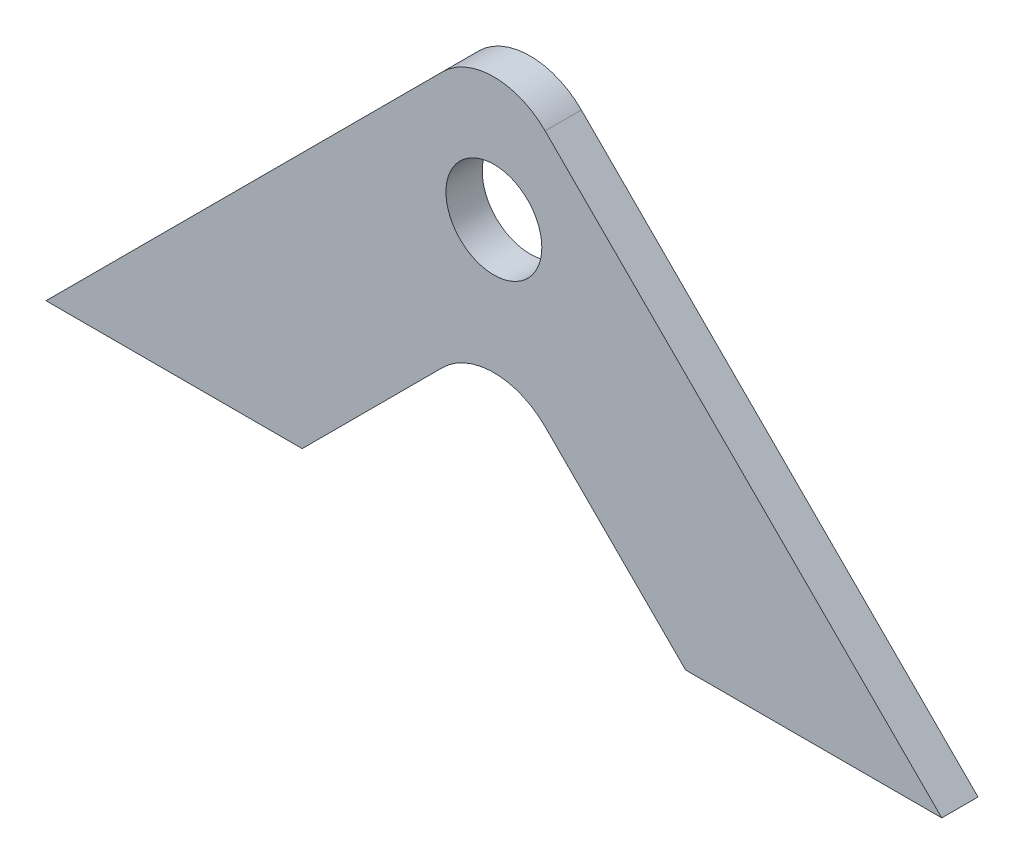
ISO-10303-21;
HEADER;
FILE_DESCRIPTION(('STEP AP214'),'2;1');
FILE_NAME('part.step','',(''),(''),'','','');
FILE_SCHEMA(('AUTOMOTIVE_DESIGN { 1 0 10303 214 1 1 1 1 }'));
ENDSEC;
DATA;
#1=APPLICATION_CONTEXT('core data for automotive mechanical design processes');
#2=APPLICATION_PROTOCOL_DEFINITION('international standard','automotive_design',2000,#1);
#3=PRODUCT_CONTEXT('',#1,'mechanical');
#4=PRODUCT('Part','Part','',(#3));
#5=PRODUCT_RELATED_PRODUCT_CATEGORY('part','',(#4));
#6=PRODUCT_DEFINITION_FORMATION('','',#4);
#7=PRODUCT_DEFINITION_CONTEXT('part definition',#1,'design');
#8=PRODUCT_DEFINITION('design','',#6,#7);
#9=PRODUCT_DEFINITION_SHAPE('','',#8);
#10=(LENGTH_UNIT() NAMED_UNIT(*) SI_UNIT(.MILLI.,.METRE.));
#11=(NAMED_UNIT(*) PLANE_ANGLE_UNIT() SI_UNIT($,.RADIAN.));
#12=(NAMED_UNIT(*) SI_UNIT($,.STERADIAN.) SOLID_ANGLE_UNIT());
#13=UNCERTAINTY_MEASURE_WITH_UNIT(LENGTH_MEASURE(1.E-05),#10,'distance_accuracy_value','');
#14=(GEOMETRIC_REPRESENTATION_CONTEXT(3) GLOBAL_UNCERTAINTY_ASSIGNED_CONTEXT((#13)) GLOBAL_UNIT_ASSIGNED_CONTEXT((#10,
#11,#12)) REPRESENTATION_CONTEXT('',''));
#15=CARTESIAN_POINT('',(0.,0.,0.));
#16=DIRECTION('',(0.,0.,1.));
#17=DIRECTION('',(1.,0.,0.));
#18=AXIS2_PLACEMENT_3D('',#15,#16,#17);
#19=CARTESIAN_POINT('',(44.8343967267449,44.8352566752149,3.175));
#20=DIRECTION('',(0.707099999869934,0.707113562438128,0.));
#21=DIRECTION('',(-0.707113562438128,0.707099999869934,0.));
#22=AXIS2_PLACEMENT_3D('',#19,#20,#21);
#23=PLANE('',#22);
#24=DIRECTION('',(0.707113562438128,-0.707099999869934,0.));
#25=VECTOR('',#24,1.);
#26=CARTESIAN_POINT('',(44.8343967267449,44.8352566752149,0.));
#27=LINE('',#26,#25);
#28=CARTESIAN_POINT('',(42.5900849991741,47.079525356474,0.));
#29=VERTEX_POINT('',#28);
#30=CARTESIAN_POINT('',(77.3512770817062,12.319,0.));
#31=VERTEX_POINT('',#30);
#32=EDGE_CURVE('E172',#29,#31,#27,.T.);
#33=ORIENTED_EDGE('',*,*,#32,.F.);
#34=DIRECTION('',(0.,0.,-1.));
#35=VECTOR('',#34,1.);
#36=CARTESIAN_POINT('',(42.5900849991741,47.079525356474,3.175));
#37=LINE('',#36,#35);
#38=CARTESIAN_POINT('',(42.5900849991741,47.079525356474,3.175));
#39=VERTEX_POINT('',#38);
#40=EDGE_CURVE('E11',#39,#29,#37,.T.);
#41=ORIENTED_EDGE('',*,*,#40,.F.);
#42=DIRECTION('',(0.707113562438128,-0.707099999869934,0.));
#43=VECTOR('',#42,1.);
#44=CARTESIAN_POINT('',(44.8343967267449,44.8352566752149,3.175));
#45=LINE('',#44,#43);
#46=CARTESIAN_POINT('',(77.3512770817062,12.319,3.175));
#47=VERTEX_POINT('',#46);
#48=EDGE_CURVE('E205',#39,#47,#45,.T.);
#49=ORIENTED_EDGE('',*,*,#48,.T.);
#50=DIRECTION('',(0.,0.,-1.));
#51=VECTOR('',#50,1.);
#52=CARTESIAN_POINT('',(77.3512770817062,12.319,3.175));
#53=LINE('',#52,#51);
#54=EDGE_CURVE('E99',#47,#31,#53,.T.);
#55=ORIENTED_EDGE('',*,*,#54,.T.);
#56=EDGE_LOOP('',(#33,#41,#49,#55));
#57=FACE_BOUND('',#56,.T.);
#58=ADVANCED_FACE('F47',(#57),#23,.T.);
#59=CARTESIAN_POINT('',(38.1,42.5893542349919,3.175));
#60=DIRECTION('',(0.,0.,-1.));
#61=DIRECTION('',(-1.,0.,0.));
#62=AXIS2_PLACEMENT_3D('',#59,#60,#61);
#63=CYLINDRICAL_SURFACE('',#62,6.35);
#64=CARTESIAN_POINT('',(38.1,42.5893542349919,0.));
#65=DIRECTION('',(0.,0.,1.));
#66=DIRECTION('',(1.,0.,0.));
#67=AXIS2_PLACEMENT_3D('',#64,#65,#66);
#68=CIRCLE('',#67,6.35);
#69=CARTESIAN_POINT('',(33.6099150008259,47.079525356474,0.));
#70=VERTEX_POINT('',#69);
#71=EDGE_CURVE('E169',#29,#70,#68,.T.);
#72=ORIENTED_EDGE('',*,*,#71,.T.);
#73=DIRECTION('',(0.,0.,-1.));
#74=VECTOR('',#73,1.);
#75=CARTESIAN_POINT('',(33.6099150008259,47.079525356474,3.175));
#76=LINE('',#75,#74);
#77=CARTESIAN_POINT('',(33.6099150008259,47.079525356474,3.175));
#78=VERTEX_POINT('',#77);
#79=EDGE_CURVE('E57',#78,#70,#76,.T.);
#80=ORIENTED_EDGE('',*,*,#79,.F.);
#81=CARTESIAN_POINT('',(38.1,42.5893542349919,3.175));
#82=DIRECTION('',(0.,0.,1.));
#83=DIRECTION('',(1.,0.,0.));
#84=AXIS2_PLACEMENT_3D('',#81,#82,#83);
#85=CIRCLE('',#84,6.35);
#86=EDGE_CURVE('E203',#39,#78,#85,.T.);
#87=ORIENTED_EDGE('',*,*,#86,.F.);
#88=ORIENTED_EDGE('',*,*,#40,.T.);
#89=EDGE_LOOP('',(#72,#80,#87,#88));
#90=FACE_BOUND('',#89,.T.);
#91=ADVANCED_FACE('F170',(#90),#63,.T.);
#92=CARTESIAN_POINT('',(-6.73512749876113,6.73525668222317,3.175));
#93=DIRECTION('',(-0.707099999869934,0.707113562438127,0.));
#94=DIRECTION('',(-0.707113562438127,-0.707099999869934,0.));
#95=AXIS2_PLACEMENT_3D('',#92,#93,#94);
#96=PLANE('',#95);
#97=DIRECTION('',(0.707113562438127,0.707099999869934,0.));
#98=VECTOR('',#97,1.);
#99=CARTESIAN_POINT('',(-6.73512749876113,6.73525668222317,0.));
#100=LINE('',#99,#98);
#101=CARTESIAN_POINT('',(-1.15127708170621,12.319,0.));
#102=VERTEX_POINT('',#101);
#103=EDGE_CURVE('E164',#102,#70,#100,.T.);
#104=ORIENTED_EDGE('',*,*,#103,.F.);
#105=DIRECTION('',(0.,0.,-1.));
#106=VECTOR('',#105,1.);
#107=CARTESIAN_POINT('',(-1.15127708170621,12.319,3.175));
#108=LINE('',#107,#106);
#109=CARTESIAN_POINT('',(-1.15127708170621,12.319,3.175));
#110=VERTEX_POINT('',#109);
#111=EDGE_CURVE('E154',#110,#102,#108,.T.);
#112=ORIENTED_EDGE('',*,*,#111,.F.);
#113=DIRECTION('',(0.707113562438127,0.707099999869934,0.));
#114=VECTOR('',#113,1.);
#115=CARTESIAN_POINT('',(-6.73512749876113,6.73525668222317,3.175));
#116=LINE('',#115,#114);
#117=EDGE_CURVE('E166',#110,#78,#116,.T.);
#118=ORIENTED_EDGE('',*,*,#117,.T.);
#119=ORIENTED_EDGE('',*,*,#79,.T.);
#120=EDGE_LOOP('',(#104,#112,#118,#119));
#121=FACE_BOUND('',#120,.T.);
#122=ADVANCED_FACE('F162',(#121),#96,.T.);
#123=CARTESIAN_POINT('',(0.,12.319,3.175));
#124=DIRECTION('',(0.,1.,0.));
#125=DIRECTION('',(0.,0.,1.));
#126=AXIS2_PLACEMENT_3D('',#123,#124,#125);
#127=PLANE('',#126);
#128=DIRECTION('',(1.,0.,0.));
#129=VECTOR('',#128,1.);
#130=CARTESIAN_POINT('',(0.,12.319,0.));
#131=LINE('',#130,#129);
#132=CARTESIAN_POINT('',(21.299578529834,12.319,0.));
#133=VERTEX_POINT('',#132);
#134=EDGE_CURVE('E177',#102,#133,#131,.T.);
#135=ORIENTED_EDGE('',*,*,#134,.T.);
#136=DIRECTION('',(0.,0.,-1.));
#137=VECTOR('',#136,1.);
#138=CARTESIAN_POINT('',(21.299578529834,12.319,3.175));
#139=LINE('',#138,#137);
#140=CARTESIAN_POINT('',(21.299578529834,12.319,3.175));
#141=VERTEX_POINT('',#140);
#142=EDGE_CURVE('E146',#141,#133,#139,.T.);
#143=ORIENTED_EDGE('',*,*,#142,.F.);
#144=DIRECTION('',(1.,0.,0.));
#145=VECTOR('',#144,1.);
#146=CARTESIAN_POINT('',(0.,12.319,3.175));
#147=LINE('',#146,#145);
#148=EDGE_CURVE('E195',#110,#141,#147,.T.);
#149=ORIENTED_EDGE('',*,*,#148,.F.);
#150=ORIENTED_EDGE('',*,*,#111,.T.);
#151=EDGE_LOOP('',(#135,#143,#149,#150));
#152=FACE_BOUND('',#151,.T.);
#153=ADVANCED_FACE('F232',(#152),#127,.F.);
#154=CARTESIAN_POINT('',(4.49008499917408,-4.49017112148211,3.175));
#155=DIRECTION('',(-0.707099999869934,0.707113562438127,0.));
#156=DIRECTION('',(-0.707113562438128,-0.707099999869934,0.));
#157=AXIS2_PLACEMENT_3D('',#154,#155,#156);
#158=PLANE('',#157);
#159=DIRECTION('',(0.707113562438128,0.707099999869934,0.));
#160=VECTOR('',#159,1.);
#161=CARTESIAN_POINT('',(4.49008499917408,-4.49017112148211,0.));
#162=LINE('',#161,#160);
#163=CARTESIAN_POINT('',(33.6099150008259,24.629100356474,0.));
#164=VERTEX_POINT('',#163);
#165=EDGE_CURVE('E181',#133,#164,#162,.T.);
#166=ORIENTED_EDGE('',*,*,#165,.T.);
#167=DIRECTION('',(0.,0.,-1.));
#168=VECTOR('',#167,1.);
#169=CARTESIAN_POINT('',(33.6099150008259,24.629100356474,3.175));
#170=LINE('',#169,#168);
#171=CARTESIAN_POINT('',(33.6099150008259,24.629100356474,3.175));
#172=VERTEX_POINT('',#171);
#173=EDGE_CURVE('E142',#172,#164,#170,.T.);
#174=ORIENTED_EDGE('',*,*,#173,.F.);
#175=DIRECTION('',(0.707113562438128,0.707099999869934,0.));
#176=VECTOR('',#175,1.);
#177=CARTESIAN_POINT('',(4.49008499917408,-4.49017112148211,3.175));
#178=LINE('',#177,#176);
#179=EDGE_CURVE('E133',#141,#172,#178,.T.);
#180=ORIENTED_EDGE('',*,*,#179,.F.);
#181=ORIENTED_EDGE('',*,*,#142,.T.);
#182=EDGE_LOOP('',(#166,#174,#180,#181));
#183=FACE_BOUND('',#182,.T.);
#184=ADVANCED_FACE('F242',(#183),#158,.F.);
#185=CARTESIAN_POINT('',(38.1,20.1389292349919,3.175));
#186=DIRECTION('',(0.,0.,-1.));
#187=DIRECTION('',(-1.,0.,0.));
#188=AXIS2_PLACEMENT_3D('',#185,#186,#187);
#189=CYLINDRICAL_SURFACE('',#188,6.35);
#190=CARTESIAN_POINT('',(38.1,20.1389292349919,0.));
#191=DIRECTION('',(0.,0.,1.));
#192=DIRECTION('',(1.,0.,0.));
#193=AXIS2_PLACEMENT_3D('',#190,#191,#192);
#194=CIRCLE('',#193,6.35);
#195=CARTESIAN_POINT('',(42.5900849991741,24.629100356474,0.));
#196=VERTEX_POINT('',#195);
#197=EDGE_CURVE('E140',#164,#196,#194,.F.);
#198=ORIENTED_EDGE('',*,*,#197,.T.);
#199=DIRECTION('',(0.,0.,-1.));
#200=VECTOR('',#199,1.);
#201=CARTESIAN_POINT('',(42.5900849991741,24.629100356474,3.175));
#202=LINE('',#201,#200);
#203=CARTESIAN_POINT('',(42.5900849991741,24.629100356474,3.175));
#204=VERTEX_POINT('',#203);
#205=EDGE_CURVE('E124',#204,#196,#202,.T.);
#206=ORIENTED_EDGE('',*,*,#205,.F.);
#207=CARTESIAN_POINT('',(38.1,20.1389292349919,3.175));
#208=DIRECTION('',(0.,0.,1.));
#209=DIRECTION('',(1.,0.,0.));
#210=AXIS2_PLACEMENT_3D('',#207,#208,#209);
#211=CIRCLE('',#210,6.35);
#212=EDGE_CURVE('E128',#172,#204,#211,.F.);
#213=ORIENTED_EDGE('',*,*,#212,.F.);
#214=ORIENTED_EDGE('',*,*,#173,.T.);
#215=EDGE_LOOP('',(#198,#206,#213,#214));
#216=FACE_BOUND('',#215,.T.);
#217=ADVANCED_FACE('F139',(#216),#189,.F.);
#218=CARTESIAN_POINT('',(33.6091842288097,33.6098288715097,3.175));
#219=DIRECTION('',(0.707099999869934,0.707113562438128,0.));
#220=DIRECTION('',(-0.707113562438128,0.707099999869934,0.));
#221=AXIS2_PLACEMENT_3D('',#218,#219,#220);
#222=PLANE('',#221);
#223=DIRECTION('',(0.707113562438128,-0.707099999869934,0.));
#224=VECTOR('',#223,1.);
#225=CARTESIAN_POINT('',(33.6091842288097,33.6098288715097,0.));
#226=LINE('',#225,#224);
#227=CARTESIAN_POINT('',(54.900421470166,12.319,0.));
#228=VERTEX_POINT('',#227);
#229=EDGE_CURVE('E190',#196,#228,#226,.T.);
#230=ORIENTED_EDGE('',*,*,#229,.T.);
#231=DIRECTION('',(0.,0.,-1.));
#232=VECTOR('',#231,1.);
#233=CARTESIAN_POINT('',(54.900421470166,12.319,3.175));
#234=LINE('',#233,#232);
#235=CARTESIAN_POINT('',(54.900421470166,12.319,3.175));
#236=VERTEX_POINT('',#235);
#237=EDGE_CURVE('E126',#236,#228,#234,.T.);
#238=ORIENTED_EDGE('',*,*,#237,.F.);
#239=DIRECTION('',(0.707113562438128,-0.707099999869934,0.));
#240=VECTOR('',#239,1.);
#241=CARTESIAN_POINT('',(33.6091842288097,33.6098288715097,3.175));
#242=LINE('',#241,#240);
#243=EDGE_CURVE('E119',#204,#236,#242,.T.);
#244=ORIENTED_EDGE('',*,*,#243,.F.);
#245=ORIENTED_EDGE('',*,*,#205,.T.);
#246=EDGE_LOOP('',(#230,#238,#244,#245));
#247=FACE_BOUND('',#246,.T.);
#248=ADVANCED_FACE('F122',(#247),#222,.F.);
#249=CARTESIAN_POINT('',(38.1,38.0992692349919,3.175));
#250=DIRECTION('',(0.,0.,-1.));
#251=DIRECTION('',(-1.,0.,0.));
#252=AXIS2_PLACEMENT_3D('',#249,#250,#251);
#253=CYLINDRICAL_SURFACE('',#252,4.19988999999999);
#254=CARTESIAN_POINT('',(38.1,38.0992692349919,3.175));
#255=DIRECTION('',(0.,0.,1.));
#256=DIRECTION('',(1.,0.,0.));
#257=AXIS2_PLACEMENT_3D('',#254,#255,#256);
#258=CIRCLE('',#257,4.19988999999999);
#259=CARTESIAN_POINT('',(42.29989,38.0992692349919,3.175));
#260=VERTEX_POINT('',#259);
#261=EDGE_CURVE('E210',#260,#260,#258,.T.);
#262=ORIENTED_EDGE('',*,*,#261,.T.);
#263=EDGE_LOOP('',(#262));
#264=FACE_BOUND('',#263,.T.);
#265=CARTESIAN_POINT('',(38.1,38.0992692349919,0.));
#266=DIRECTION('',(0.,0.,1.));
#267=DIRECTION('',(1.,0.,0.));
#268=AXIS2_PLACEMENT_3D('',#265,#266,#267);
#269=CIRCLE('',#268,4.19988999999999);
#270=CARTESIAN_POINT('',(42.29989,38.0992692349919,0.));
#271=VERTEX_POINT('',#270);
#272=EDGE_CURVE('E219',#271,#271,#269,.T.);
#273=ORIENTED_EDGE('',*,*,#272,.F.);
#274=EDGE_LOOP('',(#273));
#275=FACE_BOUND('',#274,.T.);
#276=ADVANCED_FACE('F49',(#264,#275),#253,.F.);
#277=EDGE_CURVE('E92',#228,#31,#131,.T.);
#278=ORIENTED_EDGE('',*,*,#277,.T.);
#279=ORIENTED_EDGE('',*,*,#54,.F.);
#280=EDGE_CURVE('E65',#236,#47,#147,.T.);
#281=ORIENTED_EDGE('',*,*,#280,.F.);
#282=ORIENTED_EDGE('',*,*,#237,.T.);
#283=EDGE_LOOP('',(#278,#279,#281,#282));
#284=FACE_BOUND('',#283,.T.);
#285=ADVANCED_FACE('F217',(#284),#127,.F.);
#286=CARTESIAN_POINT('',(0.,0.,3.175));
#287=DIRECTION('',(0.,0.,1.));
#288=DIRECTION('',(1.,0.,0.));
#289=AXIS2_PLACEMENT_3D('',#286,#287,#288);
#290=PLANE('',#289);
#291=ORIENTED_EDGE('',*,*,#261,.F.);
#292=EDGE_LOOP('',(#291));
#293=FACE_BOUND('',#292,.T.);
#294=ORIENTED_EDGE('',*,*,#48,.F.);
#295=ORIENTED_EDGE('',*,*,#86,.T.);
#296=ORIENTED_EDGE('',*,*,#117,.F.);
#297=ORIENTED_EDGE('',*,*,#148,.T.);
#298=ORIENTED_EDGE('',*,*,#179,.T.);
#299=ORIENTED_EDGE('',*,*,#212,.T.);
#300=ORIENTED_EDGE('',*,*,#243,.T.);
#301=ORIENTED_EDGE('',*,*,#280,.T.);
#302=EDGE_LOOP('',(#294,#295,#296,#297,#298,#299,#300,#301));
#303=FACE_BOUND('',#302,.T.);
#304=ADVANCED_FACE('F131',(#293,#303),#290,.T.);
#305=CARTESIAN_POINT('',(0.,0.,0.));
#306=DIRECTION('',(0.,0.,1.));
#307=DIRECTION('',(1.,0.,0.));
#308=AXIS2_PLACEMENT_3D('',#305,#306,#307);
#309=PLANE('',#308);
#310=ORIENTED_EDGE('',*,*,#272,.T.);
#311=EDGE_LOOP('',(#310));
#312=FACE_BOUND('',#311,.T.);
#313=ORIENTED_EDGE('',*,*,#32,.T.);
#314=ORIENTED_EDGE('',*,*,#277,.F.);
#315=ORIENTED_EDGE('',*,*,#229,.F.);
#316=ORIENTED_EDGE('',*,*,#197,.F.);
#317=ORIENTED_EDGE('',*,*,#165,.F.);
#318=ORIENTED_EDGE('',*,*,#134,.F.);
#319=ORIENTED_EDGE('',*,*,#103,.T.);
#320=ORIENTED_EDGE('',*,*,#71,.F.);
#321=EDGE_LOOP('',(#313,#314,#315,#316,#317,#318,#319,#320));
#322=FACE_BOUND('',#321,.T.);
#323=ADVANCED_FACE('F175',(#312,#322),#309,.F.);
#324=CLOSED_SHELL('',(#58,#91,#122,#153,#184,#217,#248,#276,#285,#304,#323));
#325=MANIFOLD_SOLID_BREP('B2',#324);
#326=ADVANCED_BREP_SHAPE_REPRESENTATION('',(#18,#325),#14);
#327=SHAPE_DEFINITION_REPRESENTATION(#9,#326);
ENDSEC;
END-ISO-10303-21;
